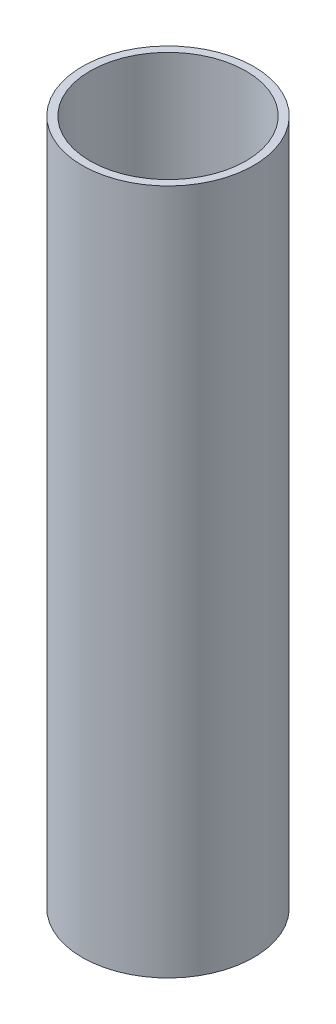
ISO-10303-21;
HEADER;
FILE_DESCRIPTION(('STEP AP214'),'2;1');
FILE_NAME('part.step','',(''),(''),'','','');
FILE_SCHEMA(('AUTOMOTIVE_DESIGN { 1 0 10303 214 1 1 1 1 }'));
ENDSEC;
DATA;
#1=APPLICATION_CONTEXT('core data for automotive mechanical design processes');
#2=APPLICATION_PROTOCOL_DEFINITION('international standard','automotive_design',2000,#1);
#3=PRODUCT_CONTEXT('',#1,'mechanical');
#4=PRODUCT('Part','Part','',(#3));
#5=PRODUCT_RELATED_PRODUCT_CATEGORY('part','',(#4));
#6=PRODUCT_DEFINITION_FORMATION('','',#4);
#7=PRODUCT_DEFINITION_CONTEXT('part definition',#1,'design');
#8=PRODUCT_DEFINITION('design','',#6,#7);
#9=PRODUCT_DEFINITION_SHAPE('','',#8);
#10=(LENGTH_UNIT() NAMED_UNIT(*) SI_UNIT(.MILLI.,.METRE.));
#11=(NAMED_UNIT(*) PLANE_ANGLE_UNIT() SI_UNIT($,.RADIAN.));
#12=(NAMED_UNIT(*) SI_UNIT($,.STERADIAN.) SOLID_ANGLE_UNIT());
#13=UNCERTAINTY_MEASURE_WITH_UNIT(LENGTH_MEASURE(1.E-05),#10,'distance_accuracy_value','');
#14=(GEOMETRIC_REPRESENTATION_CONTEXT(3) GLOBAL_UNCERTAINTY_ASSIGNED_CONTEXT((#13)) GLOBAL_UNIT_ASSIGNED_CONTEXT((#10,
#11,#12)) REPRESENTATION_CONTEXT('',''));
#15=CARTESIAN_POINT('',(0.,0.,0.));
#16=DIRECTION('',(0.,0.,1.));
#17=DIRECTION('',(1.,0.,0.));
#18=AXIS2_PLACEMENT_3D('',#15,#16,#17);
#19=CARTESIAN_POINT('',(0.,88.,0.));
#20=DIRECTION('',(0.,1.,0.));
#21=DIRECTION('',(0.,0.,1.));
#22=AXIS2_PLACEMENT_3D('',#19,#20,#21);
#23=PLANE('',#22);
#24=CARTESIAN_POINT('',(0.,88.,0.));
#25=DIRECTION('',(0.,1.,0.));
#26=DIRECTION('',(0.,0.,1.));
#27=AXIS2_PLACEMENT_3D('',#24,#25,#26);
#28=CIRCLE('',#27,11.);
#29=CARTESIAN_POINT('',(0.,88.,11.));
#30=VERTEX_POINT('',#29);
#31=EDGE_CURVE('E10',#30,#30,#28,.T.);
#32=ORIENTED_EDGE('',*,*,#31,.T.);
#33=EDGE_LOOP('',(#32));
#34=FACE_BOUND('',#33,.T.);
#35=CARTESIAN_POINT('',(0.,88.,0.));
#36=DIRECTION('',(0.,1.,0.));
#37=DIRECTION('',(0.,0.,1.));
#38=AXIS2_PLACEMENT_3D('',#35,#36,#37);
#39=CIRCLE('',#38,10.);
#40=CARTESIAN_POINT('',(0.,88.,10.));
#41=VERTEX_POINT('',#40);
#42=EDGE_CURVE('E41',#41,#41,#39,.T.);
#43=ORIENTED_EDGE('',*,*,#42,.F.);
#44=EDGE_LOOP('',(#43));
#45=FACE_BOUND('',#44,.T.);
#46=ADVANCED_FACE('F30',(#34,#45),#23,.T.);
#47=CARTESIAN_POINT('',(0.,0.,0.));
#48=DIRECTION('',(0.,1.,0.));
#49=DIRECTION('',(0.,0.,1.));
#50=AXIS2_PLACEMENT_3D('',#47,#48,#49);
#51=PLANE('',#50);
#52=CARTESIAN_POINT('',(0.,0.,0.));
#53=DIRECTION('',(0.,1.,0.));
#54=DIRECTION('',(0.,0.,1.));
#55=AXIS2_PLACEMENT_3D('',#52,#53,#54);
#56=CIRCLE('',#55,11.);
#57=CARTESIAN_POINT('',(0.,0.,11.));
#58=VERTEX_POINT('',#57);
#59=EDGE_CURVE('E34',#58,#58,#56,.T.);
#60=ORIENTED_EDGE('',*,*,#59,.F.);
#61=EDGE_LOOP('',(#60));
#62=FACE_BOUND('',#61,.T.);
#63=CARTESIAN_POINT('',(0.,0.,0.));
#64=DIRECTION('',(0.,1.,0.));
#65=DIRECTION('',(0.,0.,1.));
#66=AXIS2_PLACEMENT_3D('',#63,#64,#65);
#67=CIRCLE('',#66,10.);
#68=CARTESIAN_POINT('',(0.,0.,10.));
#69=VERTEX_POINT('',#68);
#70=EDGE_CURVE('E43',#69,#69,#67,.T.);
#71=ORIENTED_EDGE('',*,*,#70,.T.);
#72=EDGE_LOOP('',(#71));
#73=FACE_BOUND('',#72,.T.);
#74=ADVANCED_FACE('F53',(#62,#73),#51,.F.);
#75=CARTESIAN_POINT('',(0.,88.,0.));
#76=DIRECTION('',(0.,-1.,0.));
#77=DIRECTION('',(0.,0.,-1.));
#78=AXIS2_PLACEMENT_3D('',#75,#76,#77);
#79=CYLINDRICAL_SURFACE('',#78,11.);
#80=ORIENTED_EDGE('',*,*,#31,.F.);
#81=EDGE_LOOP('',(#80));
#82=FACE_BOUND('',#81,.T.);
#83=ORIENTED_EDGE('',*,*,#59,.T.);
#84=EDGE_LOOP('',(#83));
#85=FACE_BOUND('',#84,.T.);
#86=ADVANCED_FACE('F32',(#82,#85),#79,.T.);
#87=CARTESIAN_POINT('',(0.,88.,0.));
#88=DIRECTION('',(0.,-1.,0.));
#89=DIRECTION('',(0.,0.,-1.));
#90=AXIS2_PLACEMENT_3D('',#87,#88,#89);
#91=CYLINDRICAL_SURFACE('',#90,10.);
#92=ORIENTED_EDGE('',*,*,#42,.T.);
#93=EDGE_LOOP('',(#92));
#94=FACE_BOUND('',#93,.T.);
#95=ORIENTED_EDGE('',*,*,#70,.F.);
#96=EDGE_LOOP('',(#95));
#97=FACE_BOUND('',#96,.T.);
#98=ADVANCED_FACE('F49',(#94,#97),#91,.F.);
#99=CLOSED_SHELL('',(#46,#74,#86,#98));
#100=MANIFOLD_SOLID_BREP('B2',#99);
#101=ADVANCED_BREP_SHAPE_REPRESENTATION('',(#18,#100),#14);
#102=SHAPE_DEFINITION_REPRESENTATION(#9,#101);
ENDSEC;
END-ISO-10303-21;
